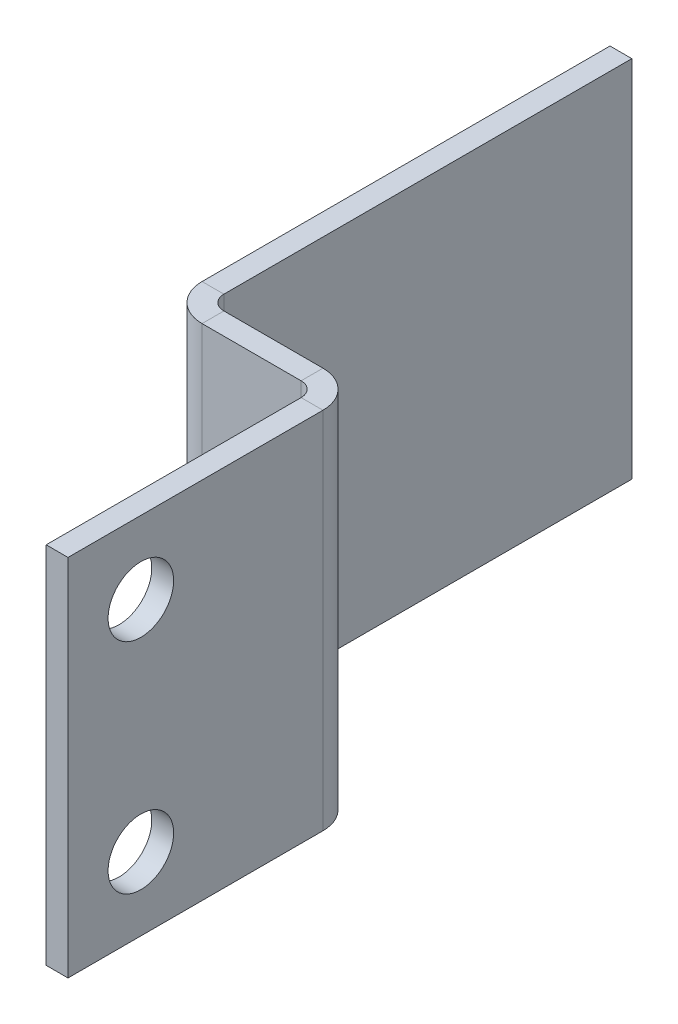
ISO-10303-21;
HEADER;
FILE_DESCRIPTION(('STEP AP214'),'2;1');
FILE_NAME('part.step','',(''),(''),'','','');
FILE_SCHEMA(('AUTOMOTIVE_DESIGN { 1 0 10303 214 1 1 1 1 }'));
ENDSEC;
DATA;
#1=APPLICATION_CONTEXT('core data for automotive mechanical design processes');
#2=APPLICATION_PROTOCOL_DEFINITION('international standard','automotive_design',2000,#1);
#3=PRODUCT_CONTEXT('',#1,'mechanical');
#4=PRODUCT('Part','Part','',(#3));
#5=PRODUCT_RELATED_PRODUCT_CATEGORY('part','',(#4));
#6=PRODUCT_DEFINITION_FORMATION('','',#4);
#7=PRODUCT_DEFINITION_CONTEXT('part definition',#1,'design');
#8=PRODUCT_DEFINITION('design','',#6,#7);
#9=PRODUCT_DEFINITION_SHAPE('','',#8);
#10=(LENGTH_UNIT() NAMED_UNIT(*) SI_UNIT(.MILLI.,.METRE.));
#11=(NAMED_UNIT(*) PLANE_ANGLE_UNIT() SI_UNIT($,.RADIAN.));
#12=(NAMED_UNIT(*) SI_UNIT($,.STERADIAN.) SOLID_ANGLE_UNIT());
#13=UNCERTAINTY_MEASURE_WITH_UNIT(LENGTH_MEASURE(1.E-05),#10,'distance_accuracy_value','');
#14=(GEOMETRIC_REPRESENTATION_CONTEXT(3) GLOBAL_UNCERTAINTY_ASSIGNED_CONTEXT((#13)) GLOBAL_UNIT_ASSIGNED_CONTEXT((#10,
#11,#12)) REPRESENTATION_CONTEXT('',''));
#15=CARTESIAN_POINT('',(0.,0.,0.));
#16=DIRECTION('',(0.,0.,1.));
#17=DIRECTION('',(1.,0.,0.));
#18=AXIS2_PLACEMENT_3D('',#15,#16,#17);
#19=CARTESIAN_POINT('',(8.8,12.5,29.));
#20=DIRECTION('',(1.,0.,0.));
#21=DIRECTION('',(0.,0.,-1.));
#22=AXIS2_PLACEMENT_3D('',#19,#20,#21);
#23=PLANE('',#22);
#24=DIRECTION('',(0.,0.,1.));
#25=VECTOR('',#24,1.);
#26=CARTESIAN_POINT('',(8.8,-12.5,29.));
#27=LINE('',#26,#25);
#28=CARTESIAN_POINT('',(8.8,-12.5,31.5));
#29=VERTEX_POINT('',#28);
#30=CARTESIAN_POINT('',(8.80000000000001,-12.5,49.));
#31=VERTEX_POINT('',#30);
#32=EDGE_CURVE('E173',#29,#31,#27,.T.);
#33=ORIENTED_EDGE('',*,*,#32,.T.);
#34=DIRECTION('',(0.,-1.,0.));
#35=VECTOR('',#34,1.);
#36=CARTESIAN_POINT('',(8.80000000000001,12.5,49.));
#37=LINE('',#36,#35);
#38=CARTESIAN_POINT('',(8.80000000000001,12.5,49.));
#39=VERTEX_POINT('',#38);
#40=EDGE_CURVE('E226',#39,#31,#37,.T.);
#41=ORIENTED_EDGE('',*,*,#40,.F.);
#42=DIRECTION('',(0.,0.,1.));
#43=VECTOR('',#42,1.);
#44=CARTESIAN_POINT('',(8.8,12.5,29.));
#45=LINE('',#44,#43);
#46=CARTESIAN_POINT('',(8.8,12.5,31.5));
#47=VERTEX_POINT('',#46);
#48=EDGE_CURVE('E108',#47,#39,#45,.T.);
#49=ORIENTED_EDGE('',*,*,#48,.F.);
#50=DIRECTION('',(0.,-1.,0.));
#51=VECTOR('',#50,1.);
#52=CARTESIAN_POINT('',(8.8,12.5,31.5));
#53=LINE('',#52,#51);
#54=EDGE_CURVE('E169',#47,#29,#53,.T.);
#55=ORIENTED_EDGE('',*,*,#54,.T.);
#56=EDGE_LOOP('',(#33,#41,#49,#55));
#57=FACE_BOUND('',#56,.T.);
#58=CARTESIAN_POINT('',(8.8,-7.5,44.));
#59=DIRECTION('',(-1.,0.,0.));
#60=DIRECTION('',(0.,0.,1.));
#61=AXIS2_PLACEMENT_3D('',#58,#59,#60);
#62=CIRCLE('',#61,2.24999999999999);
#63=CARTESIAN_POINT('',(8.8,-7.5,46.25));
#64=VERTEX_POINT('',#63);
#65=EDGE_CURVE('E271',#64,#64,#62,.T.);
#66=ORIENTED_EDGE('',*,*,#65,.F.);
#67=EDGE_LOOP('',(#66));
#68=FACE_BOUND('',#67,.T.);
#69=CARTESIAN_POINT('',(8.8,7.5,44.));
#70=DIRECTION('',(-1.,0.,0.));
#71=DIRECTION('',(0.,0.,1.));
#72=AXIS2_PLACEMENT_3D('',#69,#70,#71);
#73=CIRCLE('',#72,2.24999999999999);
#74=CARTESIAN_POINT('',(8.8,7.5,46.25));
#75=VERTEX_POINT('',#74);
#76=EDGE_CURVE('E277',#75,#75,#73,.T.);
#77=ORIENTED_EDGE('',*,*,#76,.F.);
#78=EDGE_LOOP('',(#77));
#79=FACE_BOUND('',#78,.T.);
#80=ADVANCED_FACE('F37',(#57,#68,#79),#23,.F.);
#81=CARTESIAN_POINT('',(1.,12.5,29.));
#82=DIRECTION('',(0.,1.,0.));
#83=DIRECTION('',(0.,0.,1.));
#84=AXIS2_PLACEMENT_3D('',#81,#82,#83);
#85=PLANE('',#84);
#86=DIRECTION('',(0.,0.,1.));
#87=VECTOR('',#86,1.);
#88=CARTESIAN_POINT('',(1.,12.5,29.));
#89=LINE('',#88,#87);
#90=CARTESIAN_POINT('',(1.,12.5,29.));
#91=VERTEX_POINT('',#90);
#92=CARTESIAN_POINT('',(1.,12.5,30.5));
#93=VERTEX_POINT('',#92);
#94=EDGE_CURVE('E11',#91,#93,#89,.T.);
#95=ORIENTED_EDGE('',*,*,#94,.F.);
#96=CARTESIAN_POINT('',(1.,12.5,28.));
#97=DIRECTION('',(0.,-1.,0.));
#98=DIRECTION('',(0.,0.,-1.));
#99=AXIS2_PLACEMENT_3D('',#96,#97,#98);
#100=CIRCLE('',#99,1.);
#101=CARTESIAN_POINT('',(0.,12.5,28.));
#102=VERTEX_POINT('',#101);
#103=EDGE_CURVE('E249',#102,#91,#100,.F.);
#104=ORIENTED_EDGE('',*,*,#103,.F.);
#105=DIRECTION('',(1.,0.,0.));
#106=VECTOR('',#105,1.);
#107=CARTESIAN_POINT('',(-1.5,12.5,28.));
#108=LINE('',#107,#106);
#109=CARTESIAN_POINT('',(-1.5,12.5,28.));
#110=VERTEX_POINT('',#109);
#111=EDGE_CURVE('E46',#110,#102,#108,.T.);
#112=ORIENTED_EDGE('',*,*,#111,.F.);
#113=CARTESIAN_POINT('',(1.,12.5,28.));
#114=DIRECTION('',(0.,1.,0.));
#115=DIRECTION('',(1.,0.,0.));
#116=AXIS2_PLACEMENT_3D('',#113,#114,#115);
#117=CIRCLE('',#116,2.5);
#118=EDGE_CURVE('E147',#110,#93,#117,.T.);
#119=ORIENTED_EDGE('',*,*,#118,.T.);
#120=EDGE_LOOP('',(#95,#104,#112,#119));
#121=FACE_BOUND('',#120,.T.);
#122=ADVANCED_FACE('F39',(#121),#85,.T.);
#123=CARTESIAN_POINT('',(-1.5,12.5,28.));
#124=DIRECTION('',(0.,1.,0.));
#125=DIRECTION('',(0.,0.,1.));
#126=AXIS2_PLACEMENT_3D('',#123,#124,#125);
#127=PLANE('',#126);
#128=DIRECTION('',(1.,0.,0.));
#129=VECTOR('',#128,1.);
#130=CARTESIAN_POINT('',(0.,12.5,29.));
#131=LINE('',#130,#129);
#132=CARTESIAN_POINT('',(7.8,12.5,29.));
#133=VERTEX_POINT('',#132);
#134=EDGE_CURVE('E141',#91,#133,#131,.T.);
#135=ORIENTED_EDGE('',*,*,#134,.F.);
#136=ORIENTED_EDGE('',*,*,#94,.T.);
#137=DIRECTION('',(1.,0.,0.));
#138=VECTOR('',#137,1.);
#139=CARTESIAN_POINT('',(0.,12.5,30.5));
#140=LINE('',#139,#138);
#141=CARTESIAN_POINT('',(7.8,12.5,30.5));
#142=VERTEX_POINT('',#141);
#143=EDGE_CURVE('E138',#93,#142,#140,.T.);
#144=ORIENTED_EDGE('',*,*,#143,.T.);
#145=DIRECTION('',(0.,0.,-1.));
#146=VECTOR('',#145,1.);
#147=CARTESIAN_POINT('',(7.8,12.5,30.5));
#148=LINE('',#147,#146);
#149=EDGE_CURVE('E230',#142,#133,#148,.T.);
#150=ORIENTED_EDGE('',*,*,#149,.T.);
#151=EDGE_LOOP('',(#135,#136,#144,#150));
#152=FACE_BOUND('',#151,.T.);
#153=ADVANCED_FACE('F136',(#152),#127,.T.);
#154=CARTESIAN_POINT('',(0.,-12.5,28.));
#155=DIRECTION('',(0.,-1.,0.));
#156=DIRECTION('',(0.,0.,-1.));
#157=AXIS2_PLACEMENT_3D('',#154,#155,#156);
#158=PLANE('',#157);
#159=DIRECTION('',(-1.,0.,0.));
#160=VECTOR('',#159,1.);
#161=CARTESIAN_POINT('',(0.,-12.5,28.));
#162=LINE('',#161,#160);
#163=CARTESIAN_POINT('',(0.,-12.5,28.));
#164=VERTEX_POINT('',#163);
#165=CARTESIAN_POINT('',(-1.5,-12.5,28.));
#166=VERTEX_POINT('',#165);
#167=EDGE_CURVE('E235',#164,#166,#162,.T.);
#168=ORIENTED_EDGE('',*,*,#167,.F.);
#169=CARTESIAN_POINT('',(1.,-12.5,28.));
#170=DIRECTION('',(0.,-1.,0.));
#171=DIRECTION('',(0.,0.,-1.));
#172=AXIS2_PLACEMENT_3D('',#169,#170,#171);
#173=CIRCLE('',#172,1.);
#174=CARTESIAN_POINT('',(1.,-12.5,29.));
#175=VERTEX_POINT('',#174);
#176=EDGE_CURVE('E187',#164,#175,#173,.F.);
#177=ORIENTED_EDGE('',*,*,#176,.T.);
#178=DIRECTION('',(0.,0.,-1.));
#179=VECTOR('',#178,1.);
#180=CARTESIAN_POINT('',(1.,-12.5,30.5));
#181=LINE('',#180,#179);
#182=CARTESIAN_POINT('',(1.,-12.5,30.5));
#183=VERTEX_POINT('',#182);
#184=EDGE_CURVE('E233',#183,#175,#181,.T.);
#185=ORIENTED_EDGE('',*,*,#184,.F.);
#186=CARTESIAN_POINT('',(1.,-12.5,28.));
#187=DIRECTION('',(0.,1.,0.));
#188=DIRECTION('',(1.,0.,0.));
#189=AXIS2_PLACEMENT_3D('',#186,#187,#188);
#190=CIRCLE('',#189,2.5);
#191=EDGE_CURVE('E159',#166,#183,#190,.T.);
#192=ORIENTED_EDGE('',*,*,#191,.F.);
#193=EDGE_LOOP('',(#168,#177,#185,#192));
#194=FACE_BOUND('',#193,.T.);
#195=ADVANCED_FACE('F311',(#194),#158,.T.);
#196=CARTESIAN_POINT('',(1.,-12.5,30.5));
#197=DIRECTION('',(0.,-1.,0.));
#198=DIRECTION('',(0.,0.,-1.));
#199=AXIS2_PLACEMENT_3D('',#196,#197,#198);
#200=PLANE('',#199);
#201=DIRECTION('',(0.,0.,1.));
#202=VECTOR('',#201,1.);
#203=CARTESIAN_POINT('',(0.,-12.5,0.));
#204=LINE('',#203,#202);
#205=CARTESIAN_POINT('',(0.,-12.5,0.));
#206=VERTEX_POINT('',#205);
#207=EDGE_CURVE('E190',#206,#164,#204,.T.);
#208=ORIENTED_EDGE('',*,*,#207,.T.);
#209=ORIENTED_EDGE('',*,*,#167,.T.);
#210=DIRECTION('',(0.,0.,1.));
#211=VECTOR('',#210,1.);
#212=CARTESIAN_POINT('',(-1.5,-12.5,0.));
#213=LINE('',#212,#211);
#214=CARTESIAN_POINT('',(-1.5,-12.5,0.));
#215=VERTEX_POINT('',#214);
#216=EDGE_CURVE('E196',#215,#166,#213,.T.);
#217=ORIENTED_EDGE('',*,*,#216,.F.);
#218=DIRECTION('',(1.,0.,0.));
#219=VECTOR('',#218,1.);
#220=CARTESIAN_POINT('',(-1.5,-12.5,0.));
#221=LINE('',#220,#219);
#222=EDGE_CURVE('E193',#215,#206,#221,.T.);
#223=ORIENTED_EDGE('',*,*,#222,.T.);
#224=EDGE_LOOP('',(#208,#209,#217,#223));
#225=FACE_BOUND('',#224,.T.);
#226=ADVANCED_FACE('F307',(#225),#200,.T.);
#227=CARTESIAN_POINT('',(10.3,12.5,31.5));
#228=DIRECTION('',(0.,1.,0.));
#229=DIRECTION('',(0.,0.,1.));
#230=AXIS2_PLACEMENT_3D('',#227,#228,#229);
#231=PLANE('',#230);
#232=DIRECTION('',(-1.,0.,0.));
#233=VECTOR('',#232,1.);
#234=CARTESIAN_POINT('',(10.3,12.5,31.5));
#235=LINE('',#234,#233);
#236=CARTESIAN_POINT('',(10.3,12.5,31.5));
#237=VERTEX_POINT('',#236);
#238=EDGE_CURVE('E54',#237,#47,#235,.T.);
#239=ORIENTED_EDGE('',*,*,#238,.F.);
#240=CARTESIAN_POINT('',(7.8,12.5,31.5));
#241=DIRECTION('',(0.,1.,0.));
#242=DIRECTION('',(0.,0.,1.));
#243=AXIS2_PLACEMENT_3D('',#240,#241,#242);
#244=CIRCLE('',#243,2.5);
#245=EDGE_CURVE('E259',#133,#237,#244,.F.);
#246=ORIENTED_EDGE('',*,*,#245,.F.);
#247=ORIENTED_EDGE('',*,*,#149,.F.);
#248=CARTESIAN_POINT('',(7.8,12.5,31.5));
#249=DIRECTION('',(0.,1.,0.));
#250=DIRECTION('',(1.,0.,0.));
#251=AXIS2_PLACEMENT_3D('',#248,#249,#250);
#252=CIRCLE('',#251,1.);
#253=EDGE_CURVE('E167',#142,#47,#252,.F.);
#254=ORIENTED_EDGE('',*,*,#253,.T.);
#255=EDGE_LOOP('',(#239,#246,#247,#254));
#256=FACE_BOUND('',#255,.T.);
#257=ADVANCED_FACE('F304',(#256),#231,.T.);
#258=CARTESIAN_POINT('',(7.8,12.5,30.5));
#259=DIRECTION('',(0.,1.,0.));
#260=DIRECTION('',(0.,0.,1.));
#261=AXIS2_PLACEMENT_3D('',#258,#259,#260);
#262=PLANE('',#261);
#263=DIRECTION('',(0.,0.,1.));
#264=VECTOR('',#263,1.);
#265=CARTESIAN_POINT('',(10.3,12.5,29.));
#266=LINE('',#265,#264);
#267=CARTESIAN_POINT('',(10.3,12.5,49.));
#268=VERTEX_POINT('',#267);
#269=EDGE_CURVE('E262',#237,#268,#266,.T.);
#270=ORIENTED_EDGE('',*,*,#269,.F.);
#271=ORIENTED_EDGE('',*,*,#238,.T.);
#272=ORIENTED_EDGE('',*,*,#48,.T.);
#273=DIRECTION('',(-1.,0.,0.));
#274=VECTOR('',#273,1.);
#275=CARTESIAN_POINT('',(10.3,12.5,49.));
#276=LINE('',#275,#274);
#277=EDGE_CURVE('E265',#268,#39,#276,.T.);
#278=ORIENTED_EDGE('',*,*,#277,.F.);
#279=EDGE_LOOP('',(#270,#271,#272,#278));
#280=FACE_BOUND('',#279,.T.);
#281=ADVANCED_FACE('F301',(#280),#262,.T.);
#282=CARTESIAN_POINT('',(7.8,-12.5,29.));
#283=DIRECTION('',(0.,-1.,0.));
#284=DIRECTION('',(0.,0.,-1.));
#285=AXIS2_PLACEMENT_3D('',#282,#283,#284);
#286=PLANE('',#285);
#287=DIRECTION('',(0.,0.,1.));
#288=VECTOR('',#287,1.);
#289=CARTESIAN_POINT('',(7.8,-12.5,29.));
#290=LINE('',#289,#288);
#291=CARTESIAN_POINT('',(7.8,-12.5,29.));
#292=VERTEX_POINT('',#291);
#293=CARTESIAN_POINT('',(7.8,-12.5,30.5));
#294=VERTEX_POINT('',#293);
#295=EDGE_CURVE('E95',#292,#294,#290,.T.);
#296=ORIENTED_EDGE('',*,*,#295,.F.);
#297=CARTESIAN_POINT('',(7.8,-12.5,31.5));
#298=DIRECTION('',(0.,1.,0.));
#299=DIRECTION('',(0.,0.,1.));
#300=AXIS2_PLACEMENT_3D('',#297,#298,#299);
#301=CIRCLE('',#300,2.5);
#302=CARTESIAN_POINT('',(10.3,-12.5,31.5));
#303=VERTEX_POINT('',#302);
#304=EDGE_CURVE('E183',#292,#303,#301,.F.);
#305=ORIENTED_EDGE('',*,*,#304,.T.);
#306=DIRECTION('',(1.,0.,0.));
#307=VECTOR('',#306,1.);
#308=CARTESIAN_POINT('',(8.8,-12.5,31.5));
#309=LINE('',#308,#307);
#310=EDGE_CURVE('E102',#29,#303,#309,.T.);
#311=ORIENTED_EDGE('',*,*,#310,.F.);
#312=CARTESIAN_POINT('',(7.8,-12.5,31.5));
#313=DIRECTION('',(0.,1.,0.));
#314=DIRECTION('',(1.,0.,0.));
#315=AXIS2_PLACEMENT_3D('',#312,#313,#314);
#316=CIRCLE('',#315,1.);
#317=EDGE_CURVE('E202',#294,#29,#316,.F.);
#318=ORIENTED_EDGE('',*,*,#317,.F.);
#319=EDGE_LOOP('',(#296,#305,#311,#318));
#320=FACE_BOUND('',#319,.T.);
#321=ADVANCED_FACE('F298',(#320),#286,.T.);
#322=CARTESIAN_POINT('',(8.8,-12.5,31.5));
#323=DIRECTION('',(0.,-1.,0.));
#324=DIRECTION('',(0.,0.,-1.));
#325=AXIS2_PLACEMENT_3D('',#322,#323,#324);
#326=PLANE('',#325);
#327=DIRECTION('',(1.,0.,0.));
#328=VECTOR('',#327,1.);
#329=CARTESIAN_POINT('',(0.,-12.5,29.));
#330=LINE('',#329,#328);
#331=EDGE_CURVE('E185',#175,#292,#330,.T.);
#332=ORIENTED_EDGE('',*,*,#331,.T.);
#333=ORIENTED_EDGE('',*,*,#295,.T.);
#334=DIRECTION('',(1.,0.,0.));
#335=VECTOR('',#334,1.);
#336=CARTESIAN_POINT('',(0.,-12.5,30.5));
#337=LINE('',#336,#335);
#338=EDGE_CURVE('E200',#183,#294,#337,.T.);
#339=ORIENTED_EDGE('',*,*,#338,.F.);
#340=ORIENTED_EDGE('',*,*,#184,.T.);
#341=EDGE_LOOP('',(#332,#333,#339,#340));
#342=FACE_BOUND('',#341,.T.);
#343=ADVANCED_FACE('F295',(#342),#326,.T.);
#344=CARTESIAN_POINT('',(10.3,12.5,49.));
#345=DIRECTION('',(0.,0.,1.));
#346=DIRECTION('',(1.,0.,0.));
#347=AXIS2_PLACEMENT_3D('',#344,#345,#346);
#348=PLANE('',#347);
#349=DIRECTION('',(-1.,0.,0.));
#350=VECTOR('',#349,1.);
#351=CARTESIAN_POINT('',(10.3,-12.5,49.));
#352=LINE('',#351,#350);
#353=CARTESIAN_POINT('',(10.3,-12.5,49.));
#354=VERTEX_POINT('',#353);
#355=EDGE_CURVE('E176',#354,#31,#352,.T.);
#356=ORIENTED_EDGE('',*,*,#355,.F.);
#357=DIRECTION('',(0.,-1.,0.));
#358=VECTOR('',#357,1.);
#359=CARTESIAN_POINT('',(10.3,12.5,49.));
#360=LINE('',#359,#358);
#361=EDGE_CURVE('E224',#268,#354,#360,.T.);
#362=ORIENTED_EDGE('',*,*,#361,.F.);
#363=ORIENTED_EDGE('',*,*,#277,.T.);
#364=ORIENTED_EDGE('',*,*,#40,.T.);
#365=EDGE_LOOP('',(#356,#362,#363,#364));
#366=FACE_BOUND('',#365,.T.);
#367=ADVANCED_FACE('F293',(#366),#348,.T.);
#368=CARTESIAN_POINT('',(10.3,12.5,29.));
#369=DIRECTION('',(1.,0.,0.));
#370=DIRECTION('',(0.,0.,-1.));
#371=AXIS2_PLACEMENT_3D('',#368,#369,#370);
#372=PLANE('',#371);
#373=CARTESIAN_POINT('',(10.3,7.5,44.));
#374=DIRECTION('',(1.,0.,0.));
#375=DIRECTION('',(0.,0.,-1.));
#376=AXIS2_PLACEMENT_3D('',#373,#374,#375);
#377=CIRCLE('',#376,2.24999999999999);
#378=CARTESIAN_POINT('',(10.3,7.5,41.75));
#379=VERTEX_POINT('',#378);
#380=EDGE_CURVE('E274',#379,#379,#377,.T.);
#381=ORIENTED_EDGE('',*,*,#380,.F.);
#382=EDGE_LOOP('',(#381));
#383=FACE_BOUND('',#382,.T.);
#384=CARTESIAN_POINT('',(10.3,-7.5,44.));
#385=DIRECTION('',(1.,0.,0.));
#386=DIRECTION('',(0.,0.,-1.));
#387=AXIS2_PLACEMENT_3D('',#384,#385,#386);
#388=CIRCLE('',#387,2.24999999999999);
#389=CARTESIAN_POINT('',(10.3,-7.5,41.75));
#390=VERTEX_POINT('',#389);
#391=EDGE_CURVE('E177',#390,#390,#388,.T.);
#392=ORIENTED_EDGE('',*,*,#391,.F.);
#393=EDGE_LOOP('',(#392));
#394=FACE_BOUND('',#393,.T.);
#395=DIRECTION('',(0.,0.,1.));
#396=VECTOR('',#395,1.);
#397=CARTESIAN_POINT('',(10.3,-12.5,29.));
#398=LINE('',#397,#396);
#399=EDGE_CURVE('E180',#303,#354,#398,.T.);
#400=ORIENTED_EDGE('',*,*,#399,.F.);
#401=DIRECTION('',(0.,-1.,0.));
#402=VECTOR('',#401,1.);
#403=CARTESIAN_POINT('',(10.3,12.5,31.5));
#404=LINE('',#403,#402);
#405=EDGE_CURVE('E221',#237,#303,#404,.T.);
#406=ORIENTED_EDGE('',*,*,#405,.F.);
#407=ORIENTED_EDGE('',*,*,#269,.T.);
#408=ORIENTED_EDGE('',*,*,#361,.T.);
#409=EDGE_LOOP('',(#400,#406,#407,#408));
#410=FACE_BOUND('',#409,.T.);
#411=ADVANCED_FACE('F350',(#383,#394,#410),#372,.T.);
#412=CARTESIAN_POINT('',(7.8,12.5,31.5));
#413=DIRECTION('',(0.,-1.,0.));
#414=DIRECTION('',(0.,0.,-1.));
#415=AXIS2_PLACEMENT_3D('',#412,#413,#414);
#416=CYLINDRICAL_SURFACE('',#415,2.5);
#417=ORIENTED_EDGE('',*,*,#304,.F.);
#418=DIRECTION('',(0.,-1.,0.));
#419=VECTOR('',#418,1.);
#420=CARTESIAN_POINT('',(7.8,12.5,29.));
#421=LINE('',#420,#419);
#422=EDGE_CURVE('E218',#133,#292,#421,.T.);
#423=ORIENTED_EDGE('',*,*,#422,.F.);
#424=ORIENTED_EDGE('',*,*,#245,.T.);
#425=ORIENTED_EDGE('',*,*,#405,.T.);
#426=EDGE_LOOP('',(#417,#423,#424,#425));
#427=FACE_BOUND('',#426,.T.);
#428=ADVANCED_FACE('F358',(#427),#416,.T.);
#429=CARTESIAN_POINT('',(0.,12.5,29.));
#430=DIRECTION('',(0.,0.,-1.));
#431=DIRECTION('',(-1.,0.,0.));
#432=AXIS2_PLACEMENT_3D('',#429,#430,#431);
#433=PLANE('',#432);
#434=ORIENTED_EDGE('',*,*,#331,.F.);
#435=DIRECTION('',(0.,-1.,0.));
#436=VECTOR('',#435,1.);
#437=CARTESIAN_POINT('',(1.,12.5,29.));
#438=LINE('',#437,#436);
#439=EDGE_CURVE('E215',#91,#175,#438,.T.);
#440=ORIENTED_EDGE('',*,*,#439,.F.);
#441=ORIENTED_EDGE('',*,*,#134,.T.);
#442=ORIENTED_EDGE('',*,*,#422,.T.);
#443=EDGE_LOOP('',(#434,#440,#441,#442));
#444=FACE_BOUND('',#443,.T.);
#445=ADVANCED_FACE('F365',(#444),#433,.T.);
#446=CARTESIAN_POINT('',(1.,12.5,28.));
#447=DIRECTION('',(0.,-1.,0.));
#448=DIRECTION('',(0.,0.,-1.));
#449=AXIS2_PLACEMENT_3D('',#446,#447,#448);
#450=CYLINDRICAL_SURFACE('',#449,1.);
#451=ORIENTED_EDGE('',*,*,#176,.F.);
#452=DIRECTION('',(0.,-1.,0.));
#453=VECTOR('',#452,1.);
#454=CARTESIAN_POINT('',(0.,12.5,28.));
#455=LINE('',#454,#453);
#456=EDGE_CURVE('E212',#102,#164,#455,.T.);
#457=ORIENTED_EDGE('',*,*,#456,.F.);
#458=ORIENTED_EDGE('',*,*,#103,.T.);
#459=ORIENTED_EDGE('',*,*,#439,.T.);
#460=EDGE_LOOP('',(#451,#457,#458,#459));
#461=FACE_BOUND('',#460,.T.);
#462=ADVANCED_FACE('F248',(#461),#450,.F.);
#463=CARTESIAN_POINT('',(0.,12.5,0.));
#464=DIRECTION('',(1.,0.,0.));
#465=DIRECTION('',(0.,0.,-1.));
#466=AXIS2_PLACEMENT_3D('',#463,#464,#465);
#467=PLANE('',#466);
#468=ORIENTED_EDGE('',*,*,#207,.F.);
#469=DIRECTION('',(0.,-1.,0.));
#470=VECTOR('',#469,1.);
#471=CARTESIAN_POINT('',(0.,12.5,0.));
#472=LINE('',#471,#470);
#473=CARTESIAN_POINT('',(0.,12.5,0.));
#474=VERTEX_POINT('',#473);
#475=EDGE_CURVE('E210',#474,#206,#472,.T.);
#476=ORIENTED_EDGE('',*,*,#475,.F.);
#477=DIRECTION('',(0.,0.,1.));
#478=VECTOR('',#477,1.);
#479=CARTESIAN_POINT('',(0.,12.5,0.));
#480=LINE('',#479,#478);
#481=EDGE_CURVE('E242',#474,#102,#480,.T.);
#482=ORIENTED_EDGE('',*,*,#481,.T.);
#483=ORIENTED_EDGE('',*,*,#456,.T.);
#484=EDGE_LOOP('',(#468,#476,#482,#483));
#485=FACE_BOUND('',#484,.T.);
#486=ADVANCED_FACE('F253',(#485),#467,.T.);
#487=CARTESIAN_POINT('',(-1.5,12.5,0.));
#488=DIRECTION('',(0.,0.,-1.));
#489=DIRECTION('',(-1.,0.,0.));
#490=AXIS2_PLACEMENT_3D('',#487,#488,#489);
#491=PLANE('',#490);
#492=ORIENTED_EDGE('',*,*,#222,.F.);
#493=DIRECTION('',(0.,-1.,0.));
#494=VECTOR('',#493,1.);
#495=CARTESIAN_POINT('',(-1.5,12.5,0.));
#496=LINE('',#495,#494);
#497=CARTESIAN_POINT('',(-1.5,12.5,0.));
#498=VERTEX_POINT('',#497);
#499=EDGE_CURVE('E208',#498,#215,#496,.T.);
#500=ORIENTED_EDGE('',*,*,#499,.F.);
#501=DIRECTION('',(1.,0.,0.));
#502=VECTOR('',#501,1.);
#503=CARTESIAN_POINT('',(-1.5,12.5,0.));
#504=LINE('',#503,#502);
#505=EDGE_CURVE('E254',#498,#474,#504,.T.);
#506=ORIENTED_EDGE('',*,*,#505,.T.);
#507=ORIENTED_EDGE('',*,*,#475,.T.);
#508=EDGE_LOOP('',(#492,#500,#506,#507));
#509=FACE_BOUND('',#508,.T.);
#510=ADVANCED_FACE('F386',(#509),#491,.T.);
#511=CARTESIAN_POINT('',(-1.5,12.5,0.));
#512=DIRECTION('',(1.,0.,0.));
#513=DIRECTION('',(0.,0.,-1.));
#514=AXIS2_PLACEMENT_3D('',#511,#512,#513);
#515=PLANE('',#514);
#516=ORIENTED_EDGE('',*,*,#216,.T.);
#517=DIRECTION('',(0.,-1.,0.));
#518=VECTOR('',#517,1.);
#519=CARTESIAN_POINT('',(-1.5,12.5,28.));
#520=LINE('',#519,#518);
#521=EDGE_CURVE('E161',#110,#166,#520,.T.);
#522=ORIENTED_EDGE('',*,*,#521,.F.);
#523=DIRECTION('',(0.,0.,1.));
#524=VECTOR('',#523,1.);
#525=CARTESIAN_POINT('',(-1.5,12.5,0.));
#526=LINE('',#525,#524);
#527=EDGE_CURVE('E152',#498,#110,#526,.T.);
#528=ORIENTED_EDGE('',*,*,#527,.F.);
#529=ORIENTED_EDGE('',*,*,#499,.T.);
#530=EDGE_LOOP('',(#516,#522,#528,#529));
#531=FACE_BOUND('',#530,.T.);
#532=ADVANCED_FACE('F393',(#531),#515,.F.);
#533=CARTESIAN_POINT('',(1.,12.5,28.));
#534=DIRECTION('',(0.,-1.,0.));
#535=DIRECTION('',(0.,0.,-1.));
#536=AXIS2_PLACEMENT_3D('',#533,#534,#535);
#537=CYLINDRICAL_SURFACE('',#536,2.5);
#538=ORIENTED_EDGE('',*,*,#191,.T.);
#539=DIRECTION('',(0.,-1.,0.));
#540=VECTOR('',#539,1.);
#541=CARTESIAN_POINT('',(1.,12.5,30.5));
#542=LINE('',#541,#540);
#543=EDGE_CURVE('E156',#93,#183,#542,.T.);
#544=ORIENTED_EDGE('',*,*,#543,.F.);
#545=ORIENTED_EDGE('',*,*,#118,.F.);
#546=ORIENTED_EDGE('',*,*,#521,.T.);
#547=EDGE_LOOP('',(#538,#544,#545,#546));
#548=FACE_BOUND('',#547,.T.);
#549=ADVANCED_FACE('F157',(#548),#537,.T.);
#550=CARTESIAN_POINT('',(0.,12.5,30.5));
#551=DIRECTION('',(0.,0.,-1.));
#552=DIRECTION('',(-1.,0.,0.));
#553=AXIS2_PLACEMENT_3D('',#550,#551,#552);
#554=PLANE('',#553);
#555=ORIENTED_EDGE('',*,*,#338,.T.);
#556=DIRECTION('',(0.,-1.,0.));
#557=VECTOR('',#556,1.);
#558=CARTESIAN_POINT('',(7.8,12.5,30.5));
#559=LINE('',#558,#557);
#560=EDGE_CURVE('E162',#142,#294,#559,.T.);
#561=ORIENTED_EDGE('',*,*,#560,.F.);
#562=ORIENTED_EDGE('',*,*,#143,.F.);
#563=ORIENTED_EDGE('',*,*,#543,.T.);
#564=EDGE_LOOP('',(#555,#561,#562,#563));
#565=FACE_BOUND('',#564,.T.);
#566=ADVANCED_FACE('F164',(#565),#554,.F.);
#567=CARTESIAN_POINT('',(7.8,12.5,31.5));
#568=DIRECTION('',(0.,-1.,0.));
#569=DIRECTION('',(0.,0.,-1.));
#570=AXIS2_PLACEMENT_3D('',#567,#568,#569);
#571=CYLINDRICAL_SURFACE('',#570,1.);
#572=ORIENTED_EDGE('',*,*,#317,.T.);
#573=ORIENTED_EDGE('',*,*,#54,.F.);
#574=ORIENTED_EDGE('',*,*,#253,.F.);
#575=ORIENTED_EDGE('',*,*,#560,.T.);
#576=EDGE_LOOP('',(#572,#573,#574,#575));
#577=FACE_BOUND('',#576,.T.);
#578=ADVANCED_FACE('F414',(#577),#571,.F.);
#579=CARTESIAN_POINT('',(7.8,12.5,31.5));
#580=DIRECTION('',(0.,1.,0.));
#581=DIRECTION('',(1.,0.,0.));
#582=AXIS2_PLACEMENT_3D('',#579,#580,#581);
#583=PLANE('',#582);
#584=ORIENTED_EDGE('',*,*,#527,.T.);
#585=ORIENTED_EDGE('',*,*,#111,.T.);
#586=ORIENTED_EDGE('',*,*,#481,.F.);
#587=ORIENTED_EDGE('',*,*,#505,.F.);
#588=EDGE_LOOP('',(#584,#585,#586,#587));
#589=FACE_BOUND('',#588,.T.);
#590=ADVANCED_FACE('F239',(#589),#583,.T.);
#591=CARTESIAN_POINT('',(7.8,-12.5,31.5));
#592=DIRECTION('',(0.,1.,0.));
#593=DIRECTION('',(1.,0.,0.));
#594=AXIS2_PLACEMENT_3D('',#591,#592,#593);
#595=PLANE('',#594);
#596=ORIENTED_EDGE('',*,*,#32,.F.);
#597=ORIENTED_EDGE('',*,*,#310,.T.);
#598=ORIENTED_EDGE('',*,*,#399,.T.);
#599=ORIENTED_EDGE('',*,*,#355,.T.);
#600=EDGE_LOOP('',(#596,#597,#598,#599));
#601=FACE_BOUND('',#600,.T.);
#602=ADVANCED_FACE('F428',(#601),#595,.F.);
#603=CARTESIAN_POINT('',(8.8,-7.5,44.));
#604=DIRECTION('',(-1.,0.,0.));
#605=DIRECTION('',(0.,0.,1.));
#606=AXIS2_PLACEMENT_3D('',#603,#604,#605);
#607=CYLINDRICAL_SURFACE('',#606,2.24999999999999);
#608=ORIENTED_EDGE('',*,*,#65,.T.);
#609=EDGE_LOOP('',(#608));
#610=FACE_BOUND('',#609,.T.);
#611=ORIENTED_EDGE('',*,*,#391,.T.);
#612=EDGE_LOOP('',(#611));
#613=FACE_BOUND('',#612,.T.);
#614=ADVANCED_FACE('F435',(#610,#613),#607,.F.);
#615=CARTESIAN_POINT('',(8.8,7.5,44.));
#616=DIRECTION('',(-1.,0.,0.));
#617=DIRECTION('',(0.,0.,1.));
#618=AXIS2_PLACEMENT_3D('',#615,#616,#617);
#619=CYLINDRICAL_SURFACE('',#618,2.24999999999999);
#620=ORIENTED_EDGE('',*,*,#76,.T.);
#621=EDGE_LOOP('',(#620));
#622=FACE_BOUND('',#621,.T.);
#623=ORIENTED_EDGE('',*,*,#380,.T.);
#624=EDGE_LOOP('',(#623));
#625=FACE_BOUND('',#624,.T.);
#626=ADVANCED_FACE('F281',(#622,#625),#619,.F.);
#627=CLOSED_SHELL('',(#80,#122,#153,#195,#226,#257,#281,#321,#343,#367,#411,#428,#445,#462,#486,
#510,#532,#549,#566,#578,#590,#602,#614,#626));
#628=MANIFOLD_SOLID_BREP('B2',#627);
#629=ADVANCED_BREP_SHAPE_REPRESENTATION('',(#18,#628),#14);
#630=SHAPE_DEFINITION_REPRESENTATION(#9,#629);
ENDSEC;
END-ISO-10303-21;
